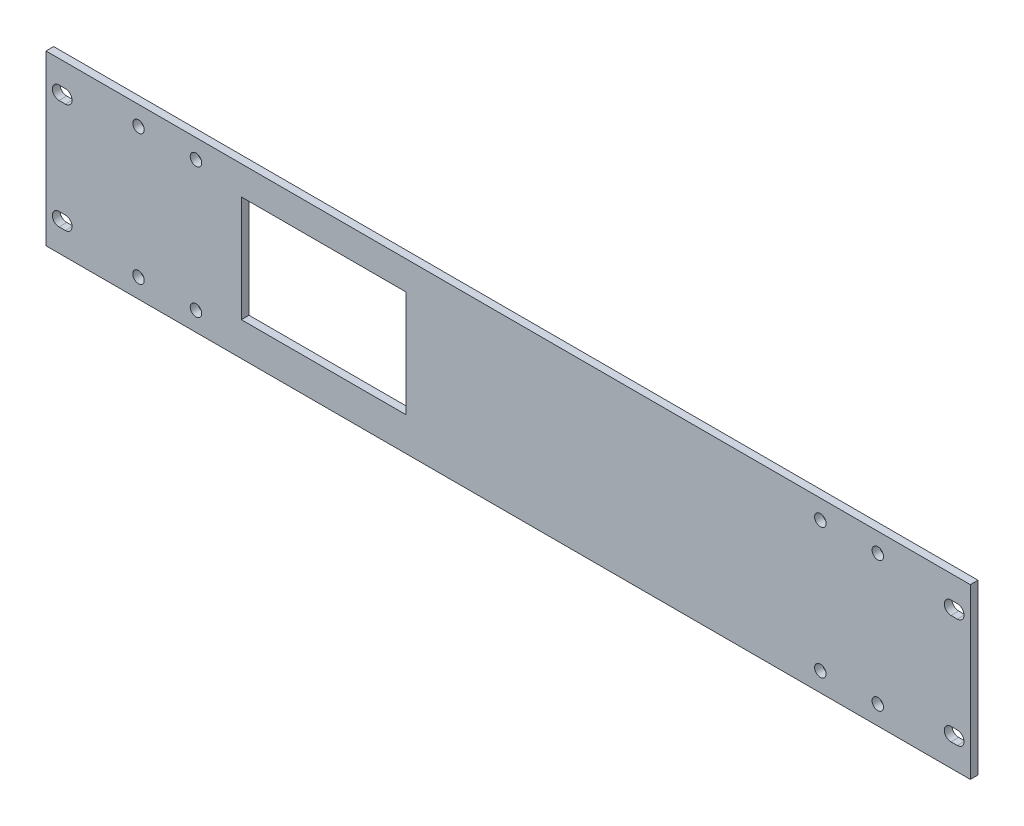
ISO-10303-21;
HEADER;
FILE_DESCRIPTION(('STEP AP214'),'2;1');
FILE_NAME('part.step','',(''),(''),'','','');
FILE_SCHEMA(('AUTOMOTIVE_DESIGN { 1 0 10303 214 1 1 1 1 }'));
ENDSEC;
DATA;
#1=APPLICATION_CONTEXT('core data for automotive mechanical design processes');
#2=APPLICATION_PROTOCOL_DEFINITION('international standard','automotive_design',2000,#1);
#3=PRODUCT_CONTEXT('',#1,'mechanical');
#4=PRODUCT('Part','Part','',(#3));
#5=PRODUCT_RELATED_PRODUCT_CATEGORY('part','',(#4));
#6=PRODUCT_DEFINITION_FORMATION('','',#4);
#7=PRODUCT_DEFINITION_CONTEXT('part definition',#1,'design');
#8=PRODUCT_DEFINITION('design','',#6,#7);
#9=PRODUCT_DEFINITION_SHAPE('','',#8);
#10=(LENGTH_UNIT() NAMED_UNIT(*) SI_UNIT(.MILLI.,.METRE.));
#11=(NAMED_UNIT(*) PLANE_ANGLE_UNIT() SI_UNIT($,.RADIAN.));
#12=(NAMED_UNIT(*) SI_UNIT($,.STERADIAN.) SOLID_ANGLE_UNIT());
#13=UNCERTAINTY_MEASURE_WITH_UNIT(LENGTH_MEASURE(1.E-05),#10,'distance_accuracy_value','');
#14=(GEOMETRIC_REPRESENTATION_CONTEXT(3) GLOBAL_UNCERTAINTY_ASSIGNED_CONTEXT((#13)) GLOBAL_UNIT_ASSIGNED_CONTEXT((#10,
#11,#12)) REPRESENTATION_CONTEXT('',''));
#15=CARTESIAN_POINT('',(0.,0.,0.));
#16=DIRECTION('',(0.,0.,1.));
#17=DIRECTION('',(1.,0.,0.));
#18=AXIS2_PLACEMENT_3D('',#15,#16,#17);
#19=CARTESIAN_POINT('',(0.,0.,4.));
#20=DIRECTION('',(1.,0.,0.));
#21=DIRECTION('',(0.,0.,-1.));
#22=AXIS2_PLACEMENT_3D('',#19,#20,#21);
#23=PLANE('',#22);
#24=DIRECTION('',(0.,-1.,0.));
#25=VECTOR('',#24,1.);
#26=CARTESIAN_POINT('',(0.,0.,0.));
#27=LINE('',#26,#25);
#28=CARTESIAN_POINT('',(0.,88.1,0.));
#29=VERTEX_POINT('',#28);
#30=CARTESIAN_POINT('',(0.,0.,0.));
#31=VERTEX_POINT('',#30);
#32=EDGE_CURVE('E401',#29,#31,#27,.T.);
#33=ORIENTED_EDGE('',*,*,#32,.T.);
#34=DIRECTION('',(0.,0.,-1.));
#35=VECTOR('',#34,1.);
#36=CARTESIAN_POINT('',(0.,0.,4.));
#37=LINE('',#36,#35);
#38=CARTESIAN_POINT('',(0.,0.,4.));
#39=VERTEX_POINT('',#38);
#40=EDGE_CURVE('E11',#39,#31,#37,.T.);
#41=ORIENTED_EDGE('',*,*,#40,.F.);
#42=DIRECTION('',(0.,-1.,0.));
#43=VECTOR('',#42,1.);
#44=CARTESIAN_POINT('',(0.,0.,4.));
#45=LINE('',#44,#43);
#46=CARTESIAN_POINT('',(0.,88.1,4.));
#47=VERTEX_POINT('',#46);
#48=EDGE_CURVE('E408',#47,#39,#45,.T.);
#49=ORIENTED_EDGE('',*,*,#48,.F.);
#50=DIRECTION('',(0.,0.,-1.));
#51=VECTOR('',#50,1.);
#52=CARTESIAN_POINT('',(0.,88.1,4.));
#53=LINE('',#52,#51);
#54=EDGE_CURVE('E418',#47,#29,#53,.T.);
#55=ORIENTED_EDGE('',*,*,#54,.T.);
#56=EDGE_LOOP('',(#33,#41,#49,#55));
#57=FACE_BOUND('',#56,.T.);
#58=ADVANCED_FACE('F35',(#57),#23,.F.);
#59=CARTESIAN_POINT('',(0.,0.,4.));
#60=DIRECTION('',(0.,1.,0.));
#61=DIRECTION('',(0.,0.,1.));
#62=AXIS2_PLACEMENT_3D('',#59,#60,#61);
#63=PLANE('',#62);
#64=DIRECTION('',(1.,0.,0.));
#65=VECTOR('',#64,1.);
#66=CARTESIAN_POINT('',(0.,0.,0.));
#67=LINE('',#66,#65);
#68=CARTESIAN_POINT('',(482.6,0.,0.));
#69=VERTEX_POINT('',#68);
#70=EDGE_CURVE('E421',#31,#69,#67,.T.);
#71=ORIENTED_EDGE('',*,*,#70,.T.);
#72=DIRECTION('',(0.,0.,-1.));
#73=VECTOR('',#72,1.);
#74=CARTESIAN_POINT('',(482.6,0.,4.));
#75=LINE('',#74,#73);
#76=CARTESIAN_POINT('',(482.6,0.,4.));
#77=VERTEX_POINT('',#76);
#78=EDGE_CURVE('E42',#77,#69,#75,.T.);
#79=ORIENTED_EDGE('',*,*,#78,.F.);
#80=DIRECTION('',(1.,0.,0.));
#81=VECTOR('',#80,1.);
#82=CARTESIAN_POINT('',(0.,0.,4.));
#83=LINE('',#82,#81);
#84=EDGE_CURVE('E411',#39,#77,#83,.T.);
#85=ORIENTED_EDGE('',*,*,#84,.F.);
#86=ORIENTED_EDGE('',*,*,#40,.T.);
#87=EDGE_LOOP('',(#71,#79,#85,#86));
#88=FACE_BOUND('',#87,.T.);
#89=ADVANCED_FACE('F450',(#88),#63,.F.);
#90=CARTESIAN_POINT('',(482.6,0.,4.));
#91=DIRECTION('',(-1.,0.,0.));
#92=DIRECTION('',(0.,0.,1.));
#93=AXIS2_PLACEMENT_3D('',#90,#91,#92);
#94=PLANE('',#93);
#95=DIRECTION('',(0.,1.,0.));
#96=VECTOR('',#95,1.);
#97=CARTESIAN_POINT('',(482.6,0.,0.));
#98=LINE('',#97,#96);
#99=CARTESIAN_POINT('',(482.6,88.1,0.));
#100=VERTEX_POINT('',#99);
#101=EDGE_CURVE('E423',#69,#100,#98,.T.);
#102=ORIENTED_EDGE('',*,*,#101,.T.);
#103=DIRECTION('',(0.,0.,-1.));
#104=VECTOR('',#103,1.);
#105=CARTESIAN_POINT('',(482.6,88.1,4.));
#106=LINE('',#105,#104);
#107=CARTESIAN_POINT('',(482.6,88.1,4.));
#108=VERTEX_POINT('',#107);
#109=EDGE_CURVE('E428',#108,#100,#106,.T.);
#110=ORIENTED_EDGE('',*,*,#109,.F.);
#111=DIRECTION('',(0.,1.,0.));
#112=VECTOR('',#111,1.);
#113=CARTESIAN_POINT('',(482.6,0.,4.));
#114=LINE('',#113,#112);
#115=EDGE_CURVE('E414',#77,#108,#114,.T.);
#116=ORIENTED_EDGE('',*,*,#115,.F.);
#117=ORIENTED_EDGE('',*,*,#78,.T.);
#118=EDGE_LOOP('',(#102,#110,#116,#117));
#119=FACE_BOUND('',#118,.T.);
#120=ADVANCED_FACE('F435',(#119),#94,.F.);
#121=CARTESIAN_POINT('',(0.,88.1,4.));
#122=DIRECTION('',(0.,-1.,0.));
#123=DIRECTION('',(0.,0.,-1.));
#124=AXIS2_PLACEMENT_3D('',#121,#122,#123);
#125=PLANE('',#124);
#126=DIRECTION('',(-1.,0.,0.));
#127=VECTOR('',#126,1.);
#128=CARTESIAN_POINT('',(0.,88.1,0.));
#129=LINE('',#128,#127);
#130=EDGE_CURVE('E412',#100,#29,#129,.T.);
#131=ORIENTED_EDGE('',*,*,#130,.T.);
#132=ORIENTED_EDGE('',*,*,#54,.F.);
#133=DIRECTION('',(-1.,0.,0.));
#134=VECTOR('',#133,1.);
#135=CARTESIAN_POINT('',(0.,88.1,4.));
#136=LINE('',#135,#134);
#137=EDGE_CURVE('E416',#108,#47,#136,.T.);
#138=ORIENTED_EDGE('',*,*,#137,.F.);
#139=ORIENTED_EDGE('',*,*,#109,.T.);
#140=EDGE_LOOP('',(#131,#132,#138,#139));
#141=FACE_BOUND('',#140,.T.);
#142=ADVANCED_FACE('F443',(#141),#125,.F.);
#143=CARTESIAN_POINT('',(0.,0.,4.));
#144=DIRECTION('',(0.,0.,-1.));
#145=DIRECTION('',(-1.,0.,0.));
#146=AXIS2_PLACEMENT_3D('',#143,#144,#145);
#147=PLANE('',#146);
#148=DIRECTION('',(1.,0.,0.));
#149=VECTOR('',#148,1.);
#150=CARTESIAN_POINT('',(102.,17.6,4.));
#151=LINE('',#150,#149);
#152=CARTESIAN_POINT('',(102.,17.6,4.));
#153=VERTEX_POINT('',#152);
#154=CARTESIAN_POINT('',(188.,17.6,4.));
#155=VERTEX_POINT('',#154);
#156=EDGE_CURVE('E222',#153,#155,#151,.T.);
#157=ORIENTED_EDGE('',*,*,#156,.F.);
#158=DIRECTION('',(0.,-1.,0.));
#159=VECTOR('',#158,1.);
#160=CARTESIAN_POINT('',(102.,73.1,4.));
#161=LINE('',#160,#159);
#162=CARTESIAN_POINT('',(102.,73.1,4.));
#163=VERTEX_POINT('',#162);
#164=EDGE_CURVE('E49',#163,#153,#161,.T.);
#165=ORIENTED_EDGE('',*,*,#164,.F.);
#166=DIRECTION('',(-1.,0.,0.));
#167=VECTOR('',#166,1.);
#168=CARTESIAN_POINT('',(102.,73.1,4.));
#169=LINE('',#168,#167);
#170=CARTESIAN_POINT('',(188.,73.1,4.));
#171=VERTEX_POINT('',#170);
#172=EDGE_CURVE('E213',#171,#163,#169,.T.);
#173=ORIENTED_EDGE('',*,*,#172,.F.);
#174=DIRECTION('',(0.,1.,0.));
#175=VECTOR('',#174,1.);
#176=CARTESIAN_POINT('',(188.,73.1,4.));
#177=LINE('',#176,#175);
#178=EDGE_CURVE('E216',#155,#171,#177,.T.);
#179=ORIENTED_EDGE('',*,*,#178,.F.);
#180=EDGE_LOOP('',(#157,#165,#173,#179));
#181=FACE_BOUND('',#180,.T.);
#182=CARTESIAN_POINT('',(48.3000000000007,10.,4.));
#183=DIRECTION('',(0.,0.,1.));
#184=DIRECTION('',(1.,0.,0.));
#185=AXIS2_PLACEMENT_3D('',#182,#183,#184);
#186=CIRCLE('',#185,3.00000000000001);
#187=CARTESIAN_POINT('',(51.3000000000007,10.,4.));
#188=VERTEX_POINT('',#187);
#189=EDGE_CURVE('E228',#188,#188,#186,.T.);
#190=ORIENTED_EDGE('',*,*,#189,.F.);
#191=EDGE_LOOP('',(#190));
#192=FACE_BOUND('',#191,.T.);
#193=CARTESIAN_POINT('',(434.300000000001,10.,4.));
#194=DIRECTION('',(0.,0.,1.));
#195=DIRECTION('',(1.,0.,0.));
#196=AXIS2_PLACEMENT_3D('',#193,#194,#195);
#197=CIRCLE('',#196,2.99999999999999);
#198=CARTESIAN_POINT('',(437.300000000001,10.,4.));
#199=VERTEX_POINT('',#198);
#200=EDGE_CURVE('E235',#199,#199,#197,.T.);
#201=ORIENTED_EDGE('',*,*,#200,.F.);
#202=EDGE_LOOP('',(#201));
#203=FACE_BOUND('',#202,.T.);
#204=CARTESIAN_POINT('',(434.3,78.1,4.));
#205=DIRECTION('',(0.,0.,1.));
#206=DIRECTION('',(1.,0.,0.));
#207=AXIS2_PLACEMENT_3D('',#204,#205,#206);
#208=CIRCLE('',#207,2.99999999999999);
#209=CARTESIAN_POINT('',(437.3,78.1,4.));
#210=VERTEX_POINT('',#209);
#211=EDGE_CURVE('E241',#210,#210,#208,.T.);
#212=ORIENTED_EDGE('',*,*,#211,.F.);
#213=EDGE_LOOP('',(#212));
#214=FACE_BOUND('',#213,.T.);
#215=CARTESIAN_POINT('',(48.3,78.1,4.));
#216=DIRECTION('',(0.,0.,1.));
#217=DIRECTION('',(1.,0.,0.));
#218=AXIS2_PLACEMENT_3D('',#215,#216,#217);
#219=CIRCLE('',#218,3.00000000000001);
#220=CARTESIAN_POINT('',(51.3,78.1,4.));
#221=VERTEX_POINT('',#220);
#222=EDGE_CURVE('E247',#221,#221,#219,.T.);
#223=ORIENTED_EDGE('',*,*,#222,.F.);
#224=EDGE_LOOP('',(#223));
#225=FACE_BOUND('',#224,.T.);
#226=CARTESIAN_POINT('',(78.3000000000007,10.,4.));
#227=DIRECTION('',(0.,0.,1.));
#228=DIRECTION('',(1.,0.,0.));
#229=AXIS2_PLACEMENT_3D('',#226,#227,#228);
#230=CIRCLE('',#229,3.00000000000001);
#231=CARTESIAN_POINT('',(81.3000000000007,10.,4.));
#232=VERTEX_POINT('',#231);
#233=EDGE_CURVE('E253',#232,#232,#230,.T.);
#234=ORIENTED_EDGE('',*,*,#233,.F.);
#235=EDGE_LOOP('',(#234));
#236=FACE_BOUND('',#235,.T.);
#237=CARTESIAN_POINT('',(404.300000000001,9.99999999999999,4.));
#238=DIRECTION('',(0.,0.,1.));
#239=DIRECTION('',(1.,0.,0.));
#240=AXIS2_PLACEMENT_3D('',#237,#238,#239);
#241=CIRCLE('',#240,2.99999999999999);
#242=CARTESIAN_POINT('',(407.300000000001,9.99999999999999,4.));
#243=VERTEX_POINT('',#242);
#244=EDGE_CURVE('E259',#243,#243,#241,.T.);
#245=ORIENTED_EDGE('',*,*,#244,.F.);
#246=EDGE_LOOP('',(#245));
#247=FACE_BOUND('',#246,.T.);
#248=CARTESIAN_POINT('',(404.3,78.1,4.));
#249=DIRECTION('',(0.,0.,1.));
#250=DIRECTION('',(1.,0.,0.));
#251=AXIS2_PLACEMENT_3D('',#248,#249,#250);
#252=CIRCLE('',#251,2.99999999999999);
#253=CARTESIAN_POINT('',(407.3,78.1,4.));
#254=VERTEX_POINT('',#253);
#255=EDGE_CURVE('E265',#254,#254,#252,.T.);
#256=ORIENTED_EDGE('',*,*,#255,.F.);
#257=EDGE_LOOP('',(#256));
#258=FACE_BOUND('',#257,.T.);
#259=CARTESIAN_POINT('',(78.3,78.1,4.));
#260=DIRECTION('',(0.,0.,1.));
#261=DIRECTION('',(1.,0.,0.));
#262=AXIS2_PLACEMENT_3D('',#259,#260,#261);
#263=CIRCLE('',#262,3.00000000000001);
#264=CARTESIAN_POINT('',(81.3,78.1,4.));
#265=VERTEX_POINT('',#264);
#266=EDGE_CURVE('E271',#265,#265,#263,.T.);
#267=ORIENTED_EDGE('',*,*,#266,.F.);
#268=EDGE_LOOP('',(#267));
#269=FACE_BOUND('',#268,.T.);
#270=DIRECTION('',(1.,0.,0.));
#271=VECTOR('',#270,1.);
#272=CARTESIAN_POINT('',(6.80000000000057,11.97,4.));
#273=LINE('',#272,#271);
#274=CARTESIAN_POINT('',(6.80000000000057,11.97,4.));
#275=VERTEX_POINT('',#274);
#276=CARTESIAN_POINT('',(10.1000000000006,11.97,4.));
#277=VERTEX_POINT('',#276);
#278=EDGE_CURVE('E295',#275,#277,#273,.T.);
#279=ORIENTED_EDGE('',*,*,#278,.F.);
#280=CARTESIAN_POINT('',(6.80000000000057,15.47,4.));
#281=DIRECTION('',(0.,0.,1.));
#282=DIRECTION('',(1.,0.,0.));
#283=AXIS2_PLACEMENT_3D('',#280,#281,#282);
#284=CIRCLE('',#283,3.5);
#285=CARTESIAN_POINT('',(6.80000000000057,18.97,4.));
#286=VERTEX_POINT('',#285);
#287=EDGE_CURVE('E277',#286,#275,#284,.T.);
#288=ORIENTED_EDGE('',*,*,#287,.F.);
#289=DIRECTION('',(-1.,0.,0.));
#290=VECTOR('',#289,1.);
#291=CARTESIAN_POINT('',(6.80000000000057,18.97,4.));
#292=LINE('',#291,#290);
#293=CARTESIAN_POINT('',(10.1000000000006,18.97,4.));
#294=VERTEX_POINT('',#293);
#295=EDGE_CURVE('E284',#294,#286,#292,.T.);
#296=ORIENTED_EDGE('',*,*,#295,.F.);
#297=CARTESIAN_POINT('',(10.1000000000006,15.47,4.));
#298=DIRECTION('',(0.,0.,1.));
#299=DIRECTION('',(1.,0.,0.));
#300=AXIS2_PLACEMENT_3D('',#297,#298,#299);
#301=CIRCLE('',#300,3.5);
#302=EDGE_CURVE('E298',#277,#294,#301,.T.);
#303=ORIENTED_EDGE('',*,*,#302,.F.);
#304=EDGE_LOOP('',(#279,#288,#296,#303));
#305=FACE_BOUND('',#304,.T.);
#306=DIRECTION('',(1.,0.,0.));
#307=VECTOR('',#306,1.);
#308=CARTESIAN_POINT('',(472.500000000001,11.97,4.));
#309=LINE('',#308,#307);
#310=CARTESIAN_POINT('',(472.500000000001,11.97,4.));
#311=VERTEX_POINT('',#310);
#312=CARTESIAN_POINT('',(475.800000000001,11.97,4.));
#313=VERTEX_POINT('',#312);
#314=EDGE_CURVE('E327',#311,#313,#309,.T.);
#315=ORIENTED_EDGE('',*,*,#314,.F.);
#316=CARTESIAN_POINT('',(472.500000000001,15.47,4.));
#317=DIRECTION('',(0.,0.,1.));
#318=DIRECTION('',(1.,0.,0.));
#319=AXIS2_PLACEMENT_3D('',#316,#317,#318);
#320=CIRCLE('',#319,3.5);
#321=CARTESIAN_POINT('',(472.500000000001,18.97,4.));
#322=VERTEX_POINT('',#321);
#323=EDGE_CURVE('E305',#322,#311,#320,.T.);
#324=ORIENTED_EDGE('',*,*,#323,.F.);
#325=DIRECTION('',(-1.,0.,0.));
#326=VECTOR('',#325,1.);
#327=CARTESIAN_POINT('',(472.500000000001,18.97,4.));
#328=LINE('',#327,#326);
#329=CARTESIAN_POINT('',(475.800000000001,18.97,4.));
#330=VERTEX_POINT('',#329);
#331=EDGE_CURVE('E316',#330,#322,#328,.T.);
#332=ORIENTED_EDGE('',*,*,#331,.F.);
#333=CARTESIAN_POINT('',(475.800000000001,15.47,4.));
#334=DIRECTION('',(0.,0.,1.));
#335=DIRECTION('',(1.,0.,0.));
#336=AXIS2_PLACEMENT_3D('',#333,#334,#335);
#337=CIRCLE('',#336,3.5);
#338=EDGE_CURVE('E330',#313,#330,#337,.T.);
#339=ORIENTED_EDGE('',*,*,#338,.F.);
#340=EDGE_LOOP('',(#315,#324,#332,#339));
#341=FACE_BOUND('',#340,.T.);
#342=DIRECTION('',(1.,0.,0.));
#343=VECTOR('',#342,1.);
#344=CARTESIAN_POINT('',(472.5,69.12,4.));
#345=LINE('',#344,#343);
#346=CARTESIAN_POINT('',(472.5,69.12,4.));
#347=VERTEX_POINT('',#346);
#348=CARTESIAN_POINT('',(475.8,69.12,4.));
#349=VERTEX_POINT('',#348);
#350=EDGE_CURVE('E359',#347,#349,#345,.T.);
#351=ORIENTED_EDGE('',*,*,#350,.F.);
#352=CARTESIAN_POINT('',(472.5,72.62,4.));
#353=DIRECTION('',(0.,0.,1.));
#354=DIRECTION('',(1.,0.,0.));
#355=AXIS2_PLACEMENT_3D('',#352,#353,#354);
#356=CIRCLE('',#355,3.5);
#357=CARTESIAN_POINT('',(472.5,76.12,4.));
#358=VERTEX_POINT('',#357);
#359=EDGE_CURVE('E337',#358,#347,#356,.T.);
#360=ORIENTED_EDGE('',*,*,#359,.F.);
#361=DIRECTION('',(-1.,0.,0.));
#362=VECTOR('',#361,1.);
#363=CARTESIAN_POINT('',(472.5,76.12,4.));
#364=LINE('',#363,#362);
#365=CARTESIAN_POINT('',(475.8,76.12,4.));
#366=VERTEX_POINT('',#365);
#367=EDGE_CURVE('E348',#366,#358,#364,.T.);
#368=ORIENTED_EDGE('',*,*,#367,.F.);
#369=CARTESIAN_POINT('',(475.8,72.62,4.));
#370=DIRECTION('',(0.,0.,1.));
#371=DIRECTION('',(1.,0.,0.));
#372=AXIS2_PLACEMENT_3D('',#369,#370,#371);
#373=CIRCLE('',#372,3.5);
#374=EDGE_CURVE('E362',#349,#366,#373,.T.);
#375=ORIENTED_EDGE('',*,*,#374,.F.);
#376=EDGE_LOOP('',(#351,#360,#368,#375));
#377=FACE_BOUND('',#376,.T.);
#378=DIRECTION('',(1.,0.,0.));
#379=VECTOR('',#378,1.);
#380=CARTESIAN_POINT('',(6.8,69.12,4.));
#381=LINE('',#380,#379);
#382=CARTESIAN_POINT('',(6.8,69.12,4.));
#383=VERTEX_POINT('',#382);
#384=CARTESIAN_POINT('',(10.1,69.12,4.));
#385=VERTEX_POINT('',#384);
#386=EDGE_CURVE('E391',#383,#385,#381,.T.);
#387=ORIENTED_EDGE('',*,*,#386,.F.);
#388=CARTESIAN_POINT('',(6.79999999999997,72.62,4.));
#389=DIRECTION('',(0.,0.,1.));
#390=DIRECTION('',(1.,0.,0.));
#391=AXIS2_PLACEMENT_3D('',#388,#389,#390);
#392=CIRCLE('',#391,3.5);
#393=CARTESIAN_POINT('',(6.8,76.12,4.));
#394=VERTEX_POINT('',#393);
#395=EDGE_CURVE('E369',#394,#383,#392,.T.);
#396=ORIENTED_EDGE('',*,*,#395,.F.);
#397=DIRECTION('',(-1.,0.,0.));
#398=VECTOR('',#397,1.);
#399=CARTESIAN_POINT('',(6.8,76.12,4.));
#400=LINE('',#399,#398);
#401=CARTESIAN_POINT('',(10.1,76.12,4.));
#402=VERTEX_POINT('',#401);
#403=EDGE_CURVE('E380',#402,#394,#400,.T.);
#404=ORIENTED_EDGE('',*,*,#403,.F.);
#405=CARTESIAN_POINT('',(10.1,72.62,4.));
#406=DIRECTION('',(0.,0.,1.));
#407=DIRECTION('',(1.,0.,0.));
#408=AXIS2_PLACEMENT_3D('',#405,#406,#407);
#409=CIRCLE('',#408,3.5);
#410=EDGE_CURVE('E394',#385,#402,#409,.T.);
#411=ORIENTED_EDGE('',*,*,#410,.F.);
#412=EDGE_LOOP('',(#387,#396,#404,#411));
#413=FACE_BOUND('',#412,.T.);
#414=ORIENTED_EDGE('',*,*,#48,.T.);
#415=ORIENTED_EDGE('',*,*,#84,.T.);
#416=ORIENTED_EDGE('',*,*,#115,.T.);
#417=ORIENTED_EDGE('',*,*,#137,.T.);
#418=EDGE_LOOP('',(#414,#415,#416,#417));
#419=FACE_BOUND('',#418,.T.);
#420=ADVANCED_FACE('F449',(#181,#192,#203,#214,#225,#236,#247,#258,#269,#305,#341,#377,#413,
#419),#147,.F.);
#421=CARTESIAN_POINT('',(0.,0.,0.));
#422=DIRECTION('',(0.,0.,-1.));
#423=DIRECTION('',(-1.,0.,0.));
#424=AXIS2_PLACEMENT_3D('',#421,#422,#423);
#425=PLANE('',#424);
#426=DIRECTION('',(0.,-1.,0.));
#427=VECTOR('',#426,1.);
#428=CARTESIAN_POINT('',(102.,73.1,0.));
#429=LINE('',#428,#427);
#430=CARTESIAN_POINT('',(102.,73.1,0.));
#431=VERTEX_POINT('',#430);
#432=CARTESIAN_POINT('',(102.,17.6,0.));
#433=VERTEX_POINT('',#432);
#434=EDGE_CURVE('E197',#431,#433,#429,.T.);
#435=ORIENTED_EDGE('',*,*,#434,.T.);
#436=DIRECTION('',(1.,0.,0.));
#437=VECTOR('',#436,1.);
#438=CARTESIAN_POINT('',(102.,17.6,0.));
#439=LINE('',#438,#437);
#440=CARTESIAN_POINT('',(188.,17.6,0.));
#441=VERTEX_POINT('',#440);
#442=EDGE_CURVE('E206',#433,#441,#439,.T.);
#443=ORIENTED_EDGE('',*,*,#442,.T.);
#444=DIRECTION('',(0.,1.,0.));
#445=VECTOR('',#444,1.);
#446=CARTESIAN_POINT('',(188.,73.1,0.));
#447=LINE('',#446,#445);
#448=CARTESIAN_POINT('',(188.,73.1,0.));
#449=VERTEX_POINT('',#448);
#450=EDGE_CURVE('E57',#441,#449,#447,.T.);
#451=ORIENTED_EDGE('',*,*,#450,.T.);
#452=DIRECTION('',(-1.,0.,0.));
#453=VECTOR('',#452,1.);
#454=CARTESIAN_POINT('',(102.,73.1,0.));
#455=LINE('',#454,#453);
#456=EDGE_CURVE('E203',#449,#431,#455,.T.);
#457=ORIENTED_EDGE('',*,*,#456,.T.);
#458=EDGE_LOOP('',(#435,#443,#451,#457));
#459=FACE_BOUND('',#458,.T.);
#460=CARTESIAN_POINT('',(48.3000000000007,10.,0.));
#461=DIRECTION('',(0.,0.,1.));
#462=DIRECTION('',(1.,0.,0.));
#463=AXIS2_PLACEMENT_3D('',#460,#461,#462);
#464=CIRCLE('',#463,3.00000000000001);
#465=CARTESIAN_POINT('',(51.3000000000007,10.,0.));
#466=VERTEX_POINT('',#465);
#467=EDGE_CURVE('E232',#466,#466,#464,.T.);
#468=ORIENTED_EDGE('',*,*,#467,.T.);
#469=EDGE_LOOP('',(#468));
#470=FACE_BOUND('',#469,.T.);
#471=CARTESIAN_POINT('',(434.300000000001,10.,0.));
#472=DIRECTION('',(0.,0.,1.));
#473=DIRECTION('',(1.,0.,0.));
#474=AXIS2_PLACEMENT_3D('',#471,#472,#473);
#475=CIRCLE('',#474,2.99999999999999);
#476=CARTESIAN_POINT('',(437.300000000001,10.,0.));
#477=VERTEX_POINT('',#476);
#478=EDGE_CURVE('E238',#477,#477,#475,.T.);
#479=ORIENTED_EDGE('',*,*,#478,.T.);
#480=EDGE_LOOP('',(#479));
#481=FACE_BOUND('',#480,.T.);
#482=CARTESIAN_POINT('',(434.3,78.1,0.));
#483=DIRECTION('',(0.,0.,1.));
#484=DIRECTION('',(1.,0.,0.));
#485=AXIS2_PLACEMENT_3D('',#482,#483,#484);
#486=CIRCLE('',#485,2.99999999999999);
#487=CARTESIAN_POINT('',(437.3,78.1,0.));
#488=VERTEX_POINT('',#487);
#489=EDGE_CURVE('E244',#488,#488,#486,.T.);
#490=ORIENTED_EDGE('',*,*,#489,.T.);
#491=EDGE_LOOP('',(#490));
#492=FACE_BOUND('',#491,.T.);
#493=CARTESIAN_POINT('',(48.3,78.1,0.));
#494=DIRECTION('',(0.,0.,1.));
#495=DIRECTION('',(1.,0.,0.));
#496=AXIS2_PLACEMENT_3D('',#493,#494,#495);
#497=CIRCLE('',#496,3.00000000000001);
#498=CARTESIAN_POINT('',(51.3,78.1,0.));
#499=VERTEX_POINT('',#498);
#500=EDGE_CURVE('E250',#499,#499,#497,.T.);
#501=ORIENTED_EDGE('',*,*,#500,.T.);
#502=EDGE_LOOP('',(#501));
#503=FACE_BOUND('',#502,.T.);
#504=CARTESIAN_POINT('',(78.3000000000007,10.,0.));
#505=DIRECTION('',(0.,0.,1.));
#506=DIRECTION('',(1.,0.,0.));
#507=AXIS2_PLACEMENT_3D('',#504,#505,#506);
#508=CIRCLE('',#507,3.00000000000001);
#509=CARTESIAN_POINT('',(81.3000000000007,10.,0.));
#510=VERTEX_POINT('',#509);
#511=EDGE_CURVE('E256',#510,#510,#508,.T.);
#512=ORIENTED_EDGE('',*,*,#511,.T.);
#513=EDGE_LOOP('',(#512));
#514=FACE_BOUND('',#513,.T.);
#515=CARTESIAN_POINT('',(404.300000000001,9.99999999999999,0.));
#516=DIRECTION('',(0.,0.,1.));
#517=DIRECTION('',(1.,0.,0.));
#518=AXIS2_PLACEMENT_3D('',#515,#516,#517);
#519=CIRCLE('',#518,2.99999999999999);
#520=CARTESIAN_POINT('',(407.300000000001,9.99999999999999,0.));
#521=VERTEX_POINT('',#520);
#522=EDGE_CURVE('E262',#521,#521,#519,.T.);
#523=ORIENTED_EDGE('',*,*,#522,.T.);
#524=EDGE_LOOP('',(#523));
#525=FACE_BOUND('',#524,.T.);
#526=CARTESIAN_POINT('',(404.3,78.1,0.));
#527=DIRECTION('',(0.,0.,1.));
#528=DIRECTION('',(1.,0.,0.));
#529=AXIS2_PLACEMENT_3D('',#526,#527,#528);
#530=CIRCLE('',#529,2.99999999999999);
#531=CARTESIAN_POINT('',(407.3,78.1,0.));
#532=VERTEX_POINT('',#531);
#533=EDGE_CURVE('E268',#532,#532,#530,.T.);
#534=ORIENTED_EDGE('',*,*,#533,.T.);
#535=EDGE_LOOP('',(#534));
#536=FACE_BOUND('',#535,.T.);
#537=CARTESIAN_POINT('',(78.3,78.1,0.));
#538=DIRECTION('',(0.,0.,1.));
#539=DIRECTION('',(1.,0.,0.));
#540=AXIS2_PLACEMENT_3D('',#537,#538,#539);
#541=CIRCLE('',#540,3.00000000000001);
#542=CARTESIAN_POINT('',(81.3,78.1,0.));
#543=VERTEX_POINT('',#542);
#544=EDGE_CURVE('E274',#543,#543,#541,.T.);
#545=ORIENTED_EDGE('',*,*,#544,.T.);
#546=EDGE_LOOP('',(#545));
#547=FACE_BOUND('',#546,.T.);
#548=CARTESIAN_POINT('',(6.80000000000057,15.47,0.));
#549=DIRECTION('',(0.,0.,1.));
#550=DIRECTION('',(1.,0.,0.));
#551=AXIS2_PLACEMENT_3D('',#548,#549,#550);
#552=CIRCLE('',#551,3.5);
#553=CARTESIAN_POINT('',(6.80000000000057,18.97,0.));
#554=VERTEX_POINT('',#553);
#555=CARTESIAN_POINT('',(6.80000000000057,11.97,0.));
#556=VERTEX_POINT('',#555);
#557=EDGE_CURVE('E280',#554,#556,#552,.T.);
#558=ORIENTED_EDGE('',*,*,#557,.T.);
#559=DIRECTION('',(1.,0.,0.));
#560=VECTOR('',#559,1.);
#561=CARTESIAN_POINT('',(6.80000000000057,11.97,0.));
#562=LINE('',#561,#560);
#563=CARTESIAN_POINT('',(10.1000000000006,11.97,0.));
#564=VERTEX_POINT('',#563);
#565=EDGE_CURVE('E283',#556,#564,#562,.T.);
#566=ORIENTED_EDGE('',*,*,#565,.T.);
#567=CARTESIAN_POINT('',(10.1000000000006,15.47,0.));
#568=DIRECTION('',(0.,0.,1.));
#569=DIRECTION('',(1.,0.,0.));
#570=AXIS2_PLACEMENT_3D('',#567,#568,#569);
#571=CIRCLE('',#570,3.5);
#572=CARTESIAN_POINT('',(10.1000000000006,18.97,0.));
#573=VERTEX_POINT('',#572);
#574=EDGE_CURVE('E287',#564,#573,#571,.T.);
#575=ORIENTED_EDGE('',*,*,#574,.T.);
#576=DIRECTION('',(-1.,0.,0.));
#577=VECTOR('',#576,1.);
#578=CARTESIAN_POINT('',(6.80000000000057,18.97,0.));
#579=LINE('',#578,#577);
#580=EDGE_CURVE('E290',#573,#554,#579,.T.);
#581=ORIENTED_EDGE('',*,*,#580,.T.);
#582=EDGE_LOOP('',(#558,#566,#575,#581));
#583=FACE_BOUND('',#582,.T.);
#584=CARTESIAN_POINT('',(472.500000000001,15.47,0.));
#585=DIRECTION('',(0.,0.,1.));
#586=DIRECTION('',(1.,0.,0.));
#587=AXIS2_PLACEMENT_3D('',#584,#585,#586);
#588=CIRCLE('',#587,3.5);
#589=CARTESIAN_POINT('',(472.500000000001,18.97,0.));
#590=VERTEX_POINT('',#589);
#591=CARTESIAN_POINT('',(472.500000000001,11.97,0.));
#592=VERTEX_POINT('',#591);
#593=EDGE_CURVE('E312',#590,#592,#588,.T.);
#594=ORIENTED_EDGE('',*,*,#593,.T.);
#595=DIRECTION('',(1.,0.,0.));
#596=VECTOR('',#595,1.);
#597=CARTESIAN_POINT('',(472.500000000001,11.97,0.));
#598=LINE('',#597,#596);
#599=CARTESIAN_POINT('',(475.800000000001,11.97,0.));
#600=VERTEX_POINT('',#599);
#601=EDGE_CURVE('E315',#592,#600,#598,.T.);
#602=ORIENTED_EDGE('',*,*,#601,.T.);
#603=CARTESIAN_POINT('',(475.800000000001,15.47,0.));
#604=DIRECTION('',(0.,0.,1.));
#605=DIRECTION('',(1.,0.,0.));
#606=AXIS2_PLACEMENT_3D('',#603,#604,#605);
#607=CIRCLE('',#606,3.5);
#608=CARTESIAN_POINT('',(475.800000000001,18.97,0.));
#609=VERTEX_POINT('',#608);
#610=EDGE_CURVE('E319',#600,#609,#607,.T.);
#611=ORIENTED_EDGE('',*,*,#610,.T.);
#612=DIRECTION('',(-1.,0.,0.));
#613=VECTOR('',#612,1.);
#614=CARTESIAN_POINT('',(472.500000000001,18.97,0.));
#615=LINE('',#614,#613);
#616=EDGE_CURVE('E322',#609,#590,#615,.T.);
#617=ORIENTED_EDGE('',*,*,#616,.T.);
#618=EDGE_LOOP('',(#594,#602,#611,#617));
#619=FACE_BOUND('',#618,.T.);
#620=CARTESIAN_POINT('',(472.5,72.62,0.));
#621=DIRECTION('',(0.,0.,1.));
#622=DIRECTION('',(1.,0.,0.));
#623=AXIS2_PLACEMENT_3D('',#620,#621,#622);
#624=CIRCLE('',#623,3.5);
#625=CARTESIAN_POINT('',(472.5,76.12,0.));
#626=VERTEX_POINT('',#625);
#627=CARTESIAN_POINT('',(472.5,69.12,0.));
#628=VERTEX_POINT('',#627);
#629=EDGE_CURVE('E344',#626,#628,#624,.T.);
#630=ORIENTED_EDGE('',*,*,#629,.T.);
#631=DIRECTION('',(1.,0.,0.));
#632=VECTOR('',#631,1.);
#633=CARTESIAN_POINT('',(472.5,69.12,0.));
#634=LINE('',#633,#632);
#635=CARTESIAN_POINT('',(475.8,69.12,0.));
#636=VERTEX_POINT('',#635);
#637=EDGE_CURVE('E347',#628,#636,#634,.T.);
#638=ORIENTED_EDGE('',*,*,#637,.T.);
#639=CARTESIAN_POINT('',(475.8,72.62,0.));
#640=DIRECTION('',(0.,0.,1.));
#641=DIRECTION('',(1.,0.,0.));
#642=AXIS2_PLACEMENT_3D('',#639,#640,#641);
#643=CIRCLE('',#642,3.5);
#644=CARTESIAN_POINT('',(475.8,76.12,0.));
#645=VERTEX_POINT('',#644);
#646=EDGE_CURVE('E351',#636,#645,#643,.T.);
#647=ORIENTED_EDGE('',*,*,#646,.T.);
#648=DIRECTION('',(-1.,0.,0.));
#649=VECTOR('',#648,1.);
#650=CARTESIAN_POINT('',(472.5,76.12,0.));
#651=LINE('',#650,#649);
#652=EDGE_CURVE('E354',#645,#626,#651,.T.);
#653=ORIENTED_EDGE('',*,*,#652,.T.);
#654=EDGE_LOOP('',(#630,#638,#647,#653));
#655=FACE_BOUND('',#654,.T.);
#656=CARTESIAN_POINT('',(6.79999999999997,72.62,0.));
#657=DIRECTION('',(0.,0.,1.));
#658=DIRECTION('',(1.,0.,0.));
#659=AXIS2_PLACEMENT_3D('',#656,#657,#658);
#660=CIRCLE('',#659,3.5);
#661=CARTESIAN_POINT('',(6.8,76.12,0.));
#662=VERTEX_POINT('',#661);
#663=CARTESIAN_POINT('',(6.8,69.12,0.));
#664=VERTEX_POINT('',#663);
#665=EDGE_CURVE('E376',#662,#664,#660,.T.);
#666=ORIENTED_EDGE('',*,*,#665,.T.);
#667=DIRECTION('',(1.,0.,0.));
#668=VECTOR('',#667,1.);
#669=CARTESIAN_POINT('',(6.8,69.12,0.));
#670=LINE('',#669,#668);
#671=CARTESIAN_POINT('',(10.1,69.12,0.));
#672=VERTEX_POINT('',#671);
#673=EDGE_CURVE('E379',#664,#672,#670,.T.);
#674=ORIENTED_EDGE('',*,*,#673,.T.);
#675=CARTESIAN_POINT('',(10.1,72.62,0.));
#676=DIRECTION('',(0.,0.,1.));
#677=DIRECTION('',(1.,0.,0.));
#678=AXIS2_PLACEMENT_3D('',#675,#676,#677);
#679=CIRCLE('',#678,3.5);
#680=CARTESIAN_POINT('',(10.1,76.12,0.));
#681=VERTEX_POINT('',#680);
#682=EDGE_CURVE('E383',#672,#681,#679,.T.);
#683=ORIENTED_EDGE('',*,*,#682,.T.);
#684=DIRECTION('',(-1.,0.,0.));
#685=VECTOR('',#684,1.);
#686=CARTESIAN_POINT('',(6.8,76.12,0.));
#687=LINE('',#686,#685);
#688=EDGE_CURVE('E386',#681,#662,#687,.T.);
#689=ORIENTED_EDGE('',*,*,#688,.T.);
#690=EDGE_LOOP('',(#666,#674,#683,#689));
#691=FACE_BOUND('',#690,.T.);
#692=ORIENTED_EDGE('',*,*,#32,.F.);
#693=ORIENTED_EDGE('',*,*,#130,.F.);
#694=ORIENTED_EDGE('',*,*,#101,.F.);
#695=ORIENTED_EDGE('',*,*,#70,.F.);
#696=EDGE_LOOP('',(#692,#693,#694,#695));
#697=FACE_BOUND('',#696,.T.);
#698=ADVANCED_FACE('F210',(#459,#470,#481,#492,#503,#514,#525,#536,#547,#583,#619,#655,#691,
#697),#425,.T.);
#699=CARTESIAN_POINT('',(6.79999999999997,72.62,0.));
#700=DIRECTION('',(0.,0.,1.));
#701=DIRECTION('',(1.,0.,0.));
#702=AXIS2_PLACEMENT_3D('',#699,#700,#701);
#703=CYLINDRICAL_SURFACE('',#702,3.5);
#704=ORIENTED_EDGE('',*,*,#395,.T.);
#705=DIRECTION('',(0.,0.,1.));
#706=VECTOR('',#705,1.);
#707=CARTESIAN_POINT('',(6.8,69.12,0.));
#708=LINE('',#707,#706);
#709=EDGE_CURVE('E389',#664,#383,#708,.T.);
#710=ORIENTED_EDGE('',*,*,#709,.F.);
#711=ORIENTED_EDGE('',*,*,#665,.F.);
#712=DIRECTION('',(0.,0.,1.));
#713=VECTOR('',#712,1.);
#714=CARTESIAN_POINT('',(6.8,76.12,0.));
#715=LINE('',#714,#713);
#716=EDGE_CURVE('E399',#662,#394,#715,.T.);
#717=ORIENTED_EDGE('',*,*,#716,.T.);
#718=EDGE_LOOP('',(#704,#710,#711,#717));
#719=FACE_BOUND('',#718,.T.);
#720=ADVANCED_FACE('F462',(#719),#703,.F.);
#721=CARTESIAN_POINT('',(6.8,76.12,0.));
#722=DIRECTION('',(0.,1.,0.));
#723=DIRECTION('',(0.,0.,1.));
#724=AXIS2_PLACEMENT_3D('',#721,#722,#723);
#725=PLANE('',#724);
#726=ORIENTED_EDGE('',*,*,#403,.T.);
#727=ORIENTED_EDGE('',*,*,#716,.F.);
#728=ORIENTED_EDGE('',*,*,#688,.F.);
#729=DIRECTION('',(0.,0.,1.));
#730=VECTOR('',#729,1.);
#731=CARTESIAN_POINT('',(10.1,76.12,0.));
#732=LINE('',#731,#730);
#733=EDGE_CURVE('E402',#681,#402,#732,.T.);
#734=ORIENTED_EDGE('',*,*,#733,.T.);
#735=EDGE_LOOP('',(#726,#727,#728,#734));
#736=FACE_BOUND('',#735,.T.);
#737=ADVANCED_FACE('F468',(#736),#725,.F.);
#738=CARTESIAN_POINT('',(10.1,72.62,0.));
#739=DIRECTION('',(0.,0.,1.));
#740=DIRECTION('',(1.,0.,0.));
#741=AXIS2_PLACEMENT_3D('',#738,#739,#740);
#742=CYLINDRICAL_SURFACE('',#741,3.5);
#743=ORIENTED_EDGE('',*,*,#410,.T.);
#744=ORIENTED_EDGE('',*,*,#733,.F.);
#745=ORIENTED_EDGE('',*,*,#682,.F.);
#746=DIRECTION('',(0.,0.,1.));
#747=VECTOR('',#746,1.);
#748=CARTESIAN_POINT('',(10.1,69.12,0.));
#749=LINE('',#748,#747);
#750=EDGE_CURVE('E404',#672,#385,#749,.T.);
#751=ORIENTED_EDGE('',*,*,#750,.T.);
#752=EDGE_LOOP('',(#743,#744,#745,#751));
#753=FACE_BOUND('',#752,.T.);
#754=ADVANCED_FACE('F474',(#753),#742,.F.);
#755=CARTESIAN_POINT('',(6.8,69.12,0.));
#756=DIRECTION('',(0.,-1.,0.));
#757=DIRECTION('',(0.,0.,-1.));
#758=AXIS2_PLACEMENT_3D('',#755,#756,#757);
#759=PLANE('',#758);
#760=ORIENTED_EDGE('',*,*,#386,.T.);
#761=ORIENTED_EDGE('',*,*,#750,.F.);
#762=ORIENTED_EDGE('',*,*,#673,.F.);
#763=ORIENTED_EDGE('',*,*,#709,.T.);
#764=EDGE_LOOP('',(#760,#761,#762,#763));
#765=FACE_BOUND('',#764,.T.);
#766=ADVANCED_FACE('F470',(#765),#759,.F.);
#767=CARTESIAN_POINT('',(472.5,72.62,0.));
#768=DIRECTION('',(0.,0.,1.));
#769=DIRECTION('',(1.,0.,0.));
#770=AXIS2_PLACEMENT_3D('',#767,#768,#769);
#771=CYLINDRICAL_SURFACE('',#770,3.5);
#772=ORIENTED_EDGE('',*,*,#359,.T.);
#773=DIRECTION('',(0.,0.,1.));
#774=VECTOR('',#773,1.);
#775=CARTESIAN_POINT('',(472.5,69.12,0.));
#776=LINE('',#775,#774);
#777=EDGE_CURVE('E357',#628,#347,#776,.T.);
#778=ORIENTED_EDGE('',*,*,#777,.F.);
#779=ORIENTED_EDGE('',*,*,#629,.F.);
#780=DIRECTION('',(0.,0.,1.));
#781=VECTOR('',#780,1.);
#782=CARTESIAN_POINT('',(472.5,76.12,0.));
#783=LINE('',#782,#781);
#784=EDGE_CURVE('E367',#626,#358,#783,.T.);
#785=ORIENTED_EDGE('',*,*,#784,.T.);
#786=EDGE_LOOP('',(#772,#778,#779,#785));
#787=FACE_BOUND('',#786,.T.);
#788=ADVANCED_FACE('F473',(#787),#771,.F.);
#789=CARTESIAN_POINT('',(472.5,76.12,0.));
#790=DIRECTION('',(0.,1.,0.));
#791=DIRECTION('',(0.,0.,1.));
#792=AXIS2_PLACEMENT_3D('',#789,#790,#791);
#793=PLANE('',#792);
#794=ORIENTED_EDGE('',*,*,#367,.T.);
#795=ORIENTED_EDGE('',*,*,#784,.F.);
#796=ORIENTED_EDGE('',*,*,#652,.F.);
#797=DIRECTION('',(0.,0.,1.));
#798=VECTOR('',#797,1.);
#799=CARTESIAN_POINT('',(475.8,76.12,0.));
#800=LINE('',#799,#798);
#801=EDGE_CURVE('E370',#645,#366,#800,.T.);
#802=ORIENTED_EDGE('',*,*,#801,.T.);
#803=EDGE_LOOP('',(#794,#795,#796,#802));
#804=FACE_BOUND('',#803,.T.);
#805=ADVANCED_FACE('F484',(#804),#793,.F.);
#806=CARTESIAN_POINT('',(475.8,72.62,0.));
#807=DIRECTION('',(0.,0.,1.));
#808=DIRECTION('',(1.,0.,0.));
#809=AXIS2_PLACEMENT_3D('',#806,#807,#808);
#810=CYLINDRICAL_SURFACE('',#809,3.5);
#811=ORIENTED_EDGE('',*,*,#374,.T.);
#812=ORIENTED_EDGE('',*,*,#801,.F.);
#813=ORIENTED_EDGE('',*,*,#646,.F.);
#814=DIRECTION('',(0.,0.,1.));
#815=VECTOR('',#814,1.);
#816=CARTESIAN_POINT('',(475.8,69.12,0.));
#817=LINE('',#816,#815);
#818=EDGE_CURVE('E372',#636,#349,#817,.T.);
#819=ORIENTED_EDGE('',*,*,#818,.T.);
#820=EDGE_LOOP('',(#811,#812,#813,#819));
#821=FACE_BOUND('',#820,.T.);
#822=ADVANCED_FACE('F490',(#821),#810,.F.);
#823=CARTESIAN_POINT('',(472.5,69.12,0.));
#824=DIRECTION('',(0.,-1.,0.));
#825=DIRECTION('',(0.,0.,-1.));
#826=AXIS2_PLACEMENT_3D('',#823,#824,#825);
#827=PLANE('',#826);
#828=ORIENTED_EDGE('',*,*,#350,.T.);
#829=ORIENTED_EDGE('',*,*,#818,.F.);
#830=ORIENTED_EDGE('',*,*,#637,.F.);
#831=ORIENTED_EDGE('',*,*,#777,.T.);
#832=EDGE_LOOP('',(#828,#829,#830,#831));
#833=FACE_BOUND('',#832,.T.);
#834=ADVANCED_FACE('F486',(#833),#827,.F.);
#835=CARTESIAN_POINT('',(472.500000000001,15.47,0.));
#836=DIRECTION('',(0.,0.,1.));
#837=DIRECTION('',(1.,0.,0.));
#838=AXIS2_PLACEMENT_3D('',#835,#836,#837);
#839=CYLINDRICAL_SURFACE('',#838,3.5);
#840=ORIENTED_EDGE('',*,*,#323,.T.);
#841=DIRECTION('',(0.,0.,1.));
#842=VECTOR('',#841,1.);
#843=CARTESIAN_POINT('',(472.500000000001,11.97,0.));
#844=LINE('',#843,#842);
#845=EDGE_CURVE('E325',#592,#311,#844,.T.);
#846=ORIENTED_EDGE('',*,*,#845,.F.);
#847=ORIENTED_EDGE('',*,*,#593,.F.);
#848=DIRECTION('',(0.,0.,1.));
#849=VECTOR('',#848,1.);
#850=CARTESIAN_POINT('',(472.500000000001,18.97,0.));
#851=LINE('',#850,#849);
#852=EDGE_CURVE('E335',#590,#322,#851,.T.);
#853=ORIENTED_EDGE('',*,*,#852,.T.);
#854=EDGE_LOOP('',(#840,#846,#847,#853));
#855=FACE_BOUND('',#854,.T.);
#856=ADVANCED_FACE('F489',(#855),#839,.F.);
#857=CARTESIAN_POINT('',(472.500000000001,18.97,0.));
#858=DIRECTION('',(0.,1.,0.));
#859=DIRECTION('',(0.,0.,1.));
#860=AXIS2_PLACEMENT_3D('',#857,#858,#859);
#861=PLANE('',#860);
#862=ORIENTED_EDGE('',*,*,#331,.T.);
#863=ORIENTED_EDGE('',*,*,#852,.F.);
#864=ORIENTED_EDGE('',*,*,#616,.F.);
#865=DIRECTION('',(0.,0.,1.));
#866=VECTOR('',#865,1.);
#867=CARTESIAN_POINT('',(475.800000000001,18.97,0.));
#868=LINE('',#867,#866);
#869=EDGE_CURVE('E338',#609,#330,#868,.T.);
#870=ORIENTED_EDGE('',*,*,#869,.T.);
#871=EDGE_LOOP('',(#862,#863,#864,#870));
#872=FACE_BOUND('',#871,.T.);
#873=ADVANCED_FACE('F500',(#872),#861,.F.);
#874=CARTESIAN_POINT('',(475.800000000001,15.47,0.));
#875=DIRECTION('',(0.,0.,1.));
#876=DIRECTION('',(1.,0.,0.));
#877=AXIS2_PLACEMENT_3D('',#874,#875,#876);
#878=CYLINDRICAL_SURFACE('',#877,3.5);
#879=ORIENTED_EDGE('',*,*,#338,.T.);
#880=ORIENTED_EDGE('',*,*,#869,.F.);
#881=ORIENTED_EDGE('',*,*,#610,.F.);
#882=DIRECTION('',(0.,0.,1.));
#883=VECTOR('',#882,1.);
#884=CARTESIAN_POINT('',(475.800000000001,11.97,0.));
#885=LINE('',#884,#883);
#886=EDGE_CURVE('E340',#600,#313,#885,.T.);
#887=ORIENTED_EDGE('',*,*,#886,.T.);
#888=EDGE_LOOP('',(#879,#880,#881,#887));
#889=FACE_BOUND('',#888,.T.);
#890=ADVANCED_FACE('F506',(#889),#878,.F.);
#891=CARTESIAN_POINT('',(472.500000000001,11.97,0.));
#892=DIRECTION('',(0.,-1.,0.));
#893=DIRECTION('',(0.,0.,-1.));
#894=AXIS2_PLACEMENT_3D('',#891,#892,#893);
#895=PLANE('',#894);
#896=ORIENTED_EDGE('',*,*,#314,.T.);
#897=ORIENTED_EDGE('',*,*,#886,.F.);
#898=ORIENTED_EDGE('',*,*,#601,.F.);
#899=ORIENTED_EDGE('',*,*,#845,.T.);
#900=EDGE_LOOP('',(#896,#897,#898,#899));
#901=FACE_BOUND('',#900,.T.);
#902=ADVANCED_FACE('F502',(#901),#895,.F.);
#903=CARTESIAN_POINT('',(6.80000000000057,15.47,0.));
#904=DIRECTION('',(0.,0.,1.));
#905=DIRECTION('',(1.,0.,0.));
#906=AXIS2_PLACEMENT_3D('',#903,#904,#905);
#907=CYLINDRICAL_SURFACE('',#906,3.5);
#908=ORIENTED_EDGE('',*,*,#287,.T.);
#909=DIRECTION('',(0.,0.,1.));
#910=VECTOR('',#909,1.);
#911=CARTESIAN_POINT('',(6.80000000000057,11.97,0.));
#912=LINE('',#911,#910);
#913=EDGE_CURVE('E293',#556,#275,#912,.T.);
#914=ORIENTED_EDGE('',*,*,#913,.F.);
#915=ORIENTED_EDGE('',*,*,#557,.F.);
#916=DIRECTION('',(0.,0.,1.));
#917=VECTOR('',#916,1.);
#918=CARTESIAN_POINT('',(6.80000000000057,18.97,0.));
#919=LINE('',#918,#917);
#920=EDGE_CURVE('E303',#554,#286,#919,.T.);
#921=ORIENTED_EDGE('',*,*,#920,.T.);
#922=EDGE_LOOP('',(#908,#914,#915,#921));
#923=FACE_BOUND('',#922,.T.);
#924=ADVANCED_FACE('F505',(#923),#907,.F.);
#925=CARTESIAN_POINT('',(6.80000000000057,18.97,0.));
#926=DIRECTION('',(0.,1.,0.));
#927=DIRECTION('',(0.,0.,1.));
#928=AXIS2_PLACEMENT_3D('',#925,#926,#927);
#929=PLANE('',#928);
#930=ORIENTED_EDGE('',*,*,#295,.T.);
#931=ORIENTED_EDGE('',*,*,#920,.F.);
#932=ORIENTED_EDGE('',*,*,#580,.F.);
#933=DIRECTION('',(0.,0.,1.));
#934=VECTOR('',#933,1.);
#935=CARTESIAN_POINT('',(10.1000000000006,18.97,0.));
#936=LINE('',#935,#934);
#937=EDGE_CURVE('E306',#573,#294,#936,.T.);
#938=ORIENTED_EDGE('',*,*,#937,.T.);
#939=EDGE_LOOP('',(#930,#931,#932,#938));
#940=FACE_BOUND('',#939,.T.);
#941=ADVANCED_FACE('F516',(#940),#929,.F.);
#942=CARTESIAN_POINT('',(10.1000000000006,15.47,0.));
#943=DIRECTION('',(0.,0.,1.));
#944=DIRECTION('',(1.,0.,0.));
#945=AXIS2_PLACEMENT_3D('',#942,#943,#944);
#946=CYLINDRICAL_SURFACE('',#945,3.5);
#947=ORIENTED_EDGE('',*,*,#302,.T.);
#948=ORIENTED_EDGE('',*,*,#937,.F.);
#949=ORIENTED_EDGE('',*,*,#574,.F.);
#950=DIRECTION('',(0.,0.,1.));
#951=VECTOR('',#950,1.);
#952=CARTESIAN_POINT('',(10.1000000000006,11.97,0.));
#953=LINE('',#952,#951);
#954=EDGE_CURVE('E308',#564,#277,#953,.T.);
#955=ORIENTED_EDGE('',*,*,#954,.T.);
#956=EDGE_LOOP('',(#947,#948,#949,#955));
#957=FACE_BOUND('',#956,.T.);
#958=ADVANCED_FACE('F522',(#957),#946,.F.);
#959=CARTESIAN_POINT('',(6.80000000000057,11.97,0.));
#960=DIRECTION('',(0.,-1.,0.));
#961=DIRECTION('',(0.,0.,-1.));
#962=AXIS2_PLACEMENT_3D('',#959,#960,#961);
#963=PLANE('',#962);
#964=ORIENTED_EDGE('',*,*,#278,.T.);
#965=ORIENTED_EDGE('',*,*,#954,.F.);
#966=ORIENTED_EDGE('',*,*,#565,.F.);
#967=ORIENTED_EDGE('',*,*,#913,.T.);
#968=EDGE_LOOP('',(#964,#965,#966,#967));
#969=FACE_BOUND('',#968,.T.);
#970=ADVANCED_FACE('F518',(#969),#963,.F.);
#971=CARTESIAN_POINT('',(78.3,78.1,0.));
#972=DIRECTION('',(0.,0.,1.));
#973=DIRECTION('',(1.,0.,0.));
#974=AXIS2_PLACEMENT_3D('',#971,#972,#973);
#975=CYLINDRICAL_SURFACE('',#974,3.00000000000001);
#976=ORIENTED_EDGE('',*,*,#544,.F.);
#977=EDGE_LOOP('',(#976));
#978=FACE_BOUND('',#977,.T.);
#979=ORIENTED_EDGE('',*,*,#266,.T.);
#980=EDGE_LOOP('',(#979));
#981=FACE_BOUND('',#980,.T.);
#982=ADVANCED_FACE('F521',(#978,#981),#975,.F.);
#983=CARTESIAN_POINT('',(404.3,78.1,0.));
#984=DIRECTION('',(0.,0.,1.));
#985=DIRECTION('',(1.,0.,0.));
#986=AXIS2_PLACEMENT_3D('',#983,#984,#985);
#987=CYLINDRICAL_SURFACE('',#986,2.99999999999999);
#988=ORIENTED_EDGE('',*,*,#533,.F.);
#989=EDGE_LOOP('',(#988));
#990=FACE_BOUND('',#989,.T.);
#991=ORIENTED_EDGE('',*,*,#255,.T.);
#992=EDGE_LOOP('',(#991));
#993=FACE_BOUND('',#992,.T.);
#994=ADVANCED_FACE('F532',(#990,#993),#987,.F.);
#995=CARTESIAN_POINT('',(404.300000000001,9.99999999999999,0.));
#996=DIRECTION('',(0.,0.,1.));
#997=DIRECTION('',(1.,0.,0.));
#998=AXIS2_PLACEMENT_3D('',#995,#996,#997);
#999=CYLINDRICAL_SURFACE('',#998,2.99999999999999);
#1000=ORIENTED_EDGE('',*,*,#522,.F.);
#1001=EDGE_LOOP('',(#1000));
#1002=FACE_BOUND('',#1001,.T.);
#1003=ORIENTED_EDGE('',*,*,#244,.T.);
#1004=EDGE_LOOP('',(#1003));
#1005=FACE_BOUND('',#1004,.T.);
#1006=ADVANCED_FACE('F536',(#1002,#1005),#999,.F.);
#1007=CARTESIAN_POINT('',(78.3000000000007,10.,0.));
#1008=DIRECTION('',(0.,0.,1.));
#1009=DIRECTION('',(1.,0.,0.));
#1010=AXIS2_PLACEMENT_3D('',#1007,#1008,#1009);
#1011=CYLINDRICAL_SURFACE('',#1010,3.00000000000001);
#1012=ORIENTED_EDGE('',*,*,#511,.F.);
#1013=EDGE_LOOP('',(#1012));
#1014=FACE_BOUND('',#1013,.T.);
#1015=ORIENTED_EDGE('',*,*,#233,.T.);
#1016=EDGE_LOOP('',(#1015));
#1017=FACE_BOUND('',#1016,.T.);
#1018=ADVANCED_FACE('F540',(#1014,#1017),#1011,.F.);
#1019=CARTESIAN_POINT('',(48.3,78.1,0.));
#1020=DIRECTION('',(0.,0.,1.));
#1021=DIRECTION('',(1.,0.,0.));
#1022=AXIS2_PLACEMENT_3D('',#1019,#1020,#1021);
#1023=CYLINDRICAL_SURFACE('',#1022,3.00000000000001);
#1024=ORIENTED_EDGE('',*,*,#500,.F.);
#1025=EDGE_LOOP('',(#1024));
#1026=FACE_BOUND('',#1025,.T.);
#1027=ORIENTED_EDGE('',*,*,#222,.T.);
#1028=EDGE_LOOP('',(#1027));
#1029=FACE_BOUND('',#1028,.T.);
#1030=ADVANCED_FACE('F544',(#1026,#1029),#1023,.F.);
#1031=CARTESIAN_POINT('',(434.3,78.1,0.));
#1032=DIRECTION('',(0.,0.,1.));
#1033=DIRECTION('',(1.,0.,0.));
#1034=AXIS2_PLACEMENT_3D('',#1031,#1032,#1033);
#1035=CYLINDRICAL_SURFACE('',#1034,2.99999999999999);
#1036=ORIENTED_EDGE('',*,*,#489,.F.);
#1037=EDGE_LOOP('',(#1036));
#1038=FACE_BOUND('',#1037,.T.);
#1039=ORIENTED_EDGE('',*,*,#211,.T.);
#1040=EDGE_LOOP('',(#1039));
#1041=FACE_BOUND('',#1040,.T.);
#1042=ADVANCED_FACE('F548',(#1038,#1041),#1035,.F.);
#1043=CARTESIAN_POINT('',(434.300000000001,10.,0.));
#1044=DIRECTION('',(0.,0.,1.));
#1045=DIRECTION('',(1.,0.,0.));
#1046=AXIS2_PLACEMENT_3D('',#1043,#1044,#1045);
#1047=CYLINDRICAL_SURFACE('',#1046,2.99999999999999);
#1048=ORIENTED_EDGE('',*,*,#478,.F.);
#1049=EDGE_LOOP('',(#1048));
#1050=FACE_BOUND('',#1049,.T.);
#1051=ORIENTED_EDGE('',*,*,#200,.T.);
#1052=EDGE_LOOP('',(#1051));
#1053=FACE_BOUND('',#1052,.T.);
#1054=ADVANCED_FACE('F552',(#1050,#1053),#1047,.F.);
#1055=CARTESIAN_POINT('',(48.3000000000007,10.,0.));
#1056=DIRECTION('',(0.,0.,1.));
#1057=DIRECTION('',(1.,0.,0.));
#1058=AXIS2_PLACEMENT_3D('',#1055,#1056,#1057);
#1059=CYLINDRICAL_SURFACE('',#1058,3.00000000000001);
#1060=ORIENTED_EDGE('',*,*,#467,.F.);
#1061=EDGE_LOOP('',(#1060));
#1062=FACE_BOUND('',#1061,.T.);
#1063=ORIENTED_EDGE('',*,*,#189,.T.);
#1064=EDGE_LOOP('',(#1063));
#1065=FACE_BOUND('',#1064,.T.);
#1066=ADVANCED_FACE('F556',(#1062,#1065),#1059,.F.);
#1067=CARTESIAN_POINT('',(102.,73.1,0.));
#1068=DIRECTION('',(-1.,0.,0.));
#1069=DIRECTION('',(0.,0.,1.));
#1070=AXIS2_PLACEMENT_3D('',#1067,#1068,#1069);
#1071=PLANE('',#1070);
#1072=ORIENTED_EDGE('',*,*,#164,.T.);
#1073=DIRECTION('',(0.,0.,1.));
#1074=VECTOR('',#1073,1.);
#1075=CARTESIAN_POINT('',(102.,17.6,0.));
#1076=LINE('',#1075,#1074);
#1077=EDGE_CURVE('E193',#433,#153,#1076,.T.);
#1078=ORIENTED_EDGE('',*,*,#1077,.F.);
#1079=ORIENTED_EDGE('',*,*,#434,.F.);
#1080=DIRECTION('',(0.,0.,1.));
#1081=VECTOR('',#1080,1.);
#1082=CARTESIAN_POINT('',(102.,73.1,0.));
#1083=LINE('',#1082,#1081);
#1084=EDGE_CURVE('E226',#431,#163,#1083,.T.);
#1085=ORIENTED_EDGE('',*,*,#1084,.T.);
#1086=EDGE_LOOP('',(#1072,#1078,#1079,#1085));
#1087=FACE_BOUND('',#1086,.T.);
#1088=ADVANCED_FACE('F195',(#1087),#1071,.F.);
#1089=CARTESIAN_POINT('',(102.,73.1,0.));
#1090=DIRECTION('',(0.,1.,0.));
#1091=DIRECTION('',(-1.,0.,0.));
#1092=AXIS2_PLACEMENT_3D('',#1089,#1090,#1091);
#1093=PLANE('',#1092);
#1094=ORIENTED_EDGE('',*,*,#172,.T.);
#1095=ORIENTED_EDGE('',*,*,#1084,.F.);
#1096=ORIENTED_EDGE('',*,*,#456,.F.);
#1097=DIRECTION('',(0.,0.,1.));
#1098=VECTOR('',#1097,1.);
#1099=CARTESIAN_POINT('',(188.,73.1,0.));
#1100=LINE('',#1099,#1098);
#1101=EDGE_CURVE('E229',#449,#171,#1100,.T.);
#1102=ORIENTED_EDGE('',*,*,#1101,.T.);
#1103=EDGE_LOOP('',(#1094,#1095,#1096,#1102));
#1104=FACE_BOUND('',#1103,.T.);
#1105=ADVANCED_FACE('F563',(#1104),#1093,.F.);
#1106=CARTESIAN_POINT('',(188.,73.1,0.));
#1107=DIRECTION('',(1.,0.,0.));
#1108=DIRECTION('',(0.,0.,-1.));
#1109=AXIS2_PLACEMENT_3D('',#1106,#1107,#1108);
#1110=PLANE('',#1109);
#1111=ORIENTED_EDGE('',*,*,#178,.T.);
#1112=ORIENTED_EDGE('',*,*,#1101,.F.);
#1113=ORIENTED_EDGE('',*,*,#450,.F.);
#1114=DIRECTION('',(0.,0.,1.));
#1115=VECTOR('',#1114,1.);
#1116=CARTESIAN_POINT('',(188.,17.6,0.));
#1117=LINE('',#1116,#1115);
#1118=EDGE_CURVE('E202',#441,#155,#1117,.T.);
#1119=ORIENTED_EDGE('',*,*,#1118,.T.);
#1120=EDGE_LOOP('',(#1111,#1112,#1113,#1119));
#1121=FACE_BOUND('',#1120,.T.);
#1122=ADVANCED_FACE('F566',(#1121),#1110,.F.);
#1123=CARTESIAN_POINT('',(102.,17.6,0.));
#1124=DIRECTION('',(0.,-1.,0.));
#1125=DIRECTION('',(0.,0.,-1.));
#1126=AXIS2_PLACEMENT_3D('',#1123,#1124,#1125);
#1127=PLANE('',#1126);
#1128=ORIENTED_EDGE('',*,*,#156,.T.);
#1129=ORIENTED_EDGE('',*,*,#1118,.F.);
#1130=ORIENTED_EDGE('',*,*,#442,.F.);
#1131=ORIENTED_EDGE('',*,*,#1077,.T.);
#1132=EDGE_LOOP('',(#1128,#1129,#1130,#1131));
#1133=FACE_BOUND('',#1132,.T.);
#1134=ADVANCED_FACE('F207',(#1133),#1127,.F.);
#1135=CLOSED_SHELL('',(#58,#89,#120,#142,#420,#698,#720,#737,#754,#766,#788,#805,#822,#834,#856,
#873,#890,#902,#924,#941,#958,#970,#982,#994,#1006,#1018,#1030,#1042,#1054,#1066,#1088,#1105,
#1122,#1134));
#1136=MANIFOLD_SOLID_BREP('B2',#1135);
#1137=ADVANCED_BREP_SHAPE_REPRESENTATION('',(#18,#1136),#14);
#1138=SHAPE_DEFINITION_REPRESENTATION(#9,#1137);
ENDSEC;
END-ISO-10303-21;
